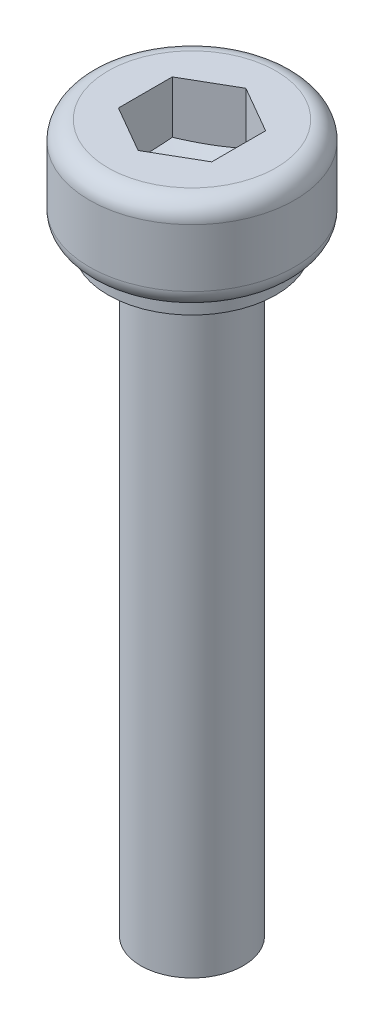
ISO-10303-21;
HEADER;
FILE_DESCRIPTION(('STEP AP214'),'2;1');
FILE_NAME('part.step','',(''),(''),'','','');
FILE_SCHEMA(('AUTOMOTIVE_DESIGN { 1 0 10303 214 1 1 1 1 }'));
ENDSEC;
DATA;
#1=APPLICATION_CONTEXT('core data for automotive mechanical design processes');
#2=APPLICATION_PROTOCOL_DEFINITION('international standard','automotive_design',2000,#1);
#3=PRODUCT_CONTEXT('',#1,'mechanical');
#4=PRODUCT('Part','Part','',(#3));
#5=PRODUCT_RELATED_PRODUCT_CATEGORY('part','',(#4));
#6=PRODUCT_DEFINITION_FORMATION('','',#4);
#7=PRODUCT_DEFINITION_CONTEXT('part definition',#1,'design');
#8=PRODUCT_DEFINITION('design','',#6,#7);
#9=PRODUCT_DEFINITION_SHAPE('','',#8);
#10=(LENGTH_UNIT() NAMED_UNIT(*) SI_UNIT(.MILLI.,.METRE.));
#11=(NAMED_UNIT(*) PLANE_ANGLE_UNIT() SI_UNIT($,.RADIAN.));
#12=(NAMED_UNIT(*) SI_UNIT($,.STERADIAN.) SOLID_ANGLE_UNIT());
#13=UNCERTAINTY_MEASURE_WITH_UNIT(LENGTH_MEASURE(1.E-05),#10,'distance_accuracy_value','');
#14=(GEOMETRIC_REPRESENTATION_CONTEXT(3) GLOBAL_UNCERTAINTY_ASSIGNED_CONTEXT((#13)) GLOBAL_UNIT_ASSIGNED_CONTEXT((#10,
#11,#12)) REPRESENTATION_CONTEXT('',''));
#15=CARTESIAN_POINT('',(0.,0.,0.));
#16=DIRECTION('',(0.,0.,1.));
#17=DIRECTION('',(1.,0.,0.));
#18=AXIS2_PLACEMENT_3D('',#15,#16,#17);
#19=CARTESIAN_POINT('',(0.,9.475,0.));
#20=DIRECTION('',(0.,-1.,0.));
#21=DIRECTION('',(0.,0.,-1.));
#22=AXIS2_PLACEMENT_3D('',#19,#20,#21);
#23=PLANE('',#22);
#24=DIRECTION('',(-0.866025403784439,0.,0.5));
#25=VECTOR('',#24,1.);
#26=CARTESIAN_POINT('',(0.,9.475,-1.44337567297406));
#27=LINE('',#26,#25);
#28=CARTESIAN_POINT('',(0.,9.475,-1.44337567297406));
#29=VERTEX_POINT('',#28);
#30=CARTESIAN_POINT('',(-1.25,9.475,-0.721687836487033));
#31=VERTEX_POINT('',#30);
#32=EDGE_CURVE('E215',#29,#31,#27,.T.);
#33=ORIENTED_EDGE('',*,*,#32,.F.);
#34=DIRECTION('',(-0.866025403784439,0.,-0.5));
#35=VECTOR('',#34,1.);
#36=CARTESIAN_POINT('',(1.25,9.475,-0.721687836487033));
#37=LINE('',#36,#35);
#38=CARTESIAN_POINT('',(1.25,9.475,-0.721687836487033));
#39=VERTEX_POINT('',#38);
#40=EDGE_CURVE('E64',#39,#29,#37,.T.);
#41=ORIENTED_EDGE('',*,*,#40,.F.);
#42=DIRECTION('',(0.,0.,-1.));
#43=VECTOR('',#42,1.);
#44=CARTESIAN_POINT('',(1.25,9.475,0.721687836487033));
#45=LINE('',#44,#43);
#46=CARTESIAN_POINT('',(1.25,9.475,0.721687836487033));
#47=VERTEX_POINT('',#46);
#48=EDGE_CURVE('E126',#47,#39,#45,.T.);
#49=ORIENTED_EDGE('',*,*,#48,.F.);
#50=DIRECTION('',(0.866025403784439,0.,-0.5));
#51=VECTOR('',#50,1.);
#52=CARTESIAN_POINT('',(0.,9.475,1.44337567297406));
#53=LINE('',#52,#51);
#54=CARTESIAN_POINT('',(0.,9.475,1.44337567297406));
#55=VERTEX_POINT('',#54);
#56=EDGE_CURVE('E133',#55,#47,#53,.T.);
#57=ORIENTED_EDGE('',*,*,#56,.F.);
#58=DIRECTION('',(0.866025403784439,0.,0.5));
#59=VECTOR('',#58,1.);
#60=CARTESIAN_POINT('',(-1.25,9.475,0.721687836487033));
#61=LINE('',#60,#59);
#62=CARTESIAN_POINT('',(-1.25,9.475,0.721687836487033));
#63=VERTEX_POINT('',#62);
#64=EDGE_CURVE('E392',#63,#55,#61,.T.);
#65=ORIENTED_EDGE('',*,*,#64,.F.);
#66=DIRECTION('',(0.,0.,1.));
#67=VECTOR('',#66,1.);
#68=CARTESIAN_POINT('',(-1.25,9.475,-0.721687836487033));
#69=LINE('',#68,#67);
#70=EDGE_CURVE('E406',#31,#63,#69,.T.);
#71=ORIENTED_EDGE('',*,*,#70,.F.);
#72=EDGE_LOOP('',(#33,#41,#49,#57,#65,#71));
#73=FACE_BOUND('',#72,.T.);
#74=CARTESIAN_POINT('',(0.,9.475,0.));
#75=DIRECTION('',(0.,1.,0.));
#76=DIRECTION('',(0.,0.,1.));
#77=AXIS2_PLACEMENT_3D('',#74,#75,#76);
#78=CIRCLE('',#77,2.25);
#79=CARTESIAN_POINT('',(0.,9.475,2.25));
#80=VERTEX_POINT('',#79);
#81=EDGE_CURVE('E11',#80,#80,#78,.T.);
#82=ORIENTED_EDGE('',*,*,#81,.T.);
#83=EDGE_LOOP('',(#82));
#84=FACE_BOUND('',#83,.T.);
#85=ADVANCED_FACE('F49',(#73,#84),#23,.F.);
#86=CARTESIAN_POINT('',(0.,8.975,0.));
#87=DIRECTION('',(0.,1.,0.));
#88=DIRECTION('',(0.,0.,1.));
#89=AXIS2_PLACEMENT_3D('',#86,#87,#88);
#90=TOROIDAL_SURFACE('',#89,2.25,0.5);
#91=ORIENTED_EDGE('',*,*,#81,.F.);
#92=EDGE_LOOP('',(#91));
#93=FACE_BOUND('',#92,.T.);
#94=CARTESIAN_POINT('',(0.,8.975,0.));
#95=DIRECTION('',(0.,1.,0.));
#96=DIRECTION('',(0.,0.,1.));
#97=AXIS2_PLACEMENT_3D('',#94,#95,#96);
#98=CIRCLE('',#97,2.75);
#99=CARTESIAN_POINT('',(0.,8.975,2.75));
#100=VERTEX_POINT('',#99);
#101=EDGE_CURVE('E57',#100,#100,#98,.T.);
#102=ORIENTED_EDGE('',*,*,#101,.T.);
#103=EDGE_LOOP('',(#102));
#104=FACE_BOUND('',#103,.T.);
#105=ADVANCED_FACE('F206',(#93,#104),#90,.T.);
#106=CARTESIAN_POINT('',(0.,4.09422492401216,0.));
#107=DIRECTION('',(0.,1.,0.));
#108=DIRECTION('',(0.,0.,1.));
#109=AXIS2_PLACEMENT_3D('',#106,#107,#108);
#110=CYLINDRICAL_SURFACE('',#109,2.75);
#111=ORIENTED_EDGE('',*,*,#101,.F.);
#112=EDGE_LOOP('',(#111));
#113=FACE_BOUND('',#112,.T.);
#114=CARTESIAN_POINT('',(0.,7.425,0.));
#115=DIRECTION('',(0.,1.,0.));
#116=DIRECTION('',(0.,0.,1.));
#117=AXIS2_PLACEMENT_3D('',#114,#115,#116);
#118=CIRCLE('',#117,2.75);
#119=CARTESIAN_POINT('',(0.,7.425,2.75));
#120=VERTEX_POINT('',#119);
#121=EDGE_CURVE('E222',#120,#120,#118,.T.);
#122=ORIENTED_EDGE('',*,*,#121,.T.);
#123=EDGE_LOOP('',(#122));
#124=FACE_BOUND('',#123,.T.);
#125=ADVANCED_FACE('F211',(#113,#124),#110,.T.);
#126=CARTESIAN_POINT('',(0.,7.425,0.));
#127=DIRECTION('',(0.,1.,0.));
#128=DIRECTION('',(0.,0.,1.));
#129=AXIS2_PLACEMENT_3D('',#126,#127,#128);
#130=TOROIDAL_SURFACE('',#129,2.25,0.5);
#131=ORIENTED_EDGE('',*,*,#121,.F.);
#132=EDGE_LOOP('',(#131));
#133=FACE_BOUND('',#132,.T.);
#134=CARTESIAN_POINT('',(0.,6.925,0.));
#135=DIRECTION('',(0.,1.,0.));
#136=DIRECTION('',(0.,0.,1.));
#137=AXIS2_PLACEMENT_3D('',#134,#135,#136);
#138=CIRCLE('',#137,2.25);
#139=CARTESIAN_POINT('',(0.,6.925,2.25));
#140=VERTEX_POINT('',#139);
#141=EDGE_CURVE('E225',#140,#140,#138,.T.);
#142=ORIENTED_EDGE('',*,*,#141,.T.);
#143=EDGE_LOOP('',(#142));
#144=FACE_BOUND('',#143,.T.);
#145=ADVANCED_FACE('F262',(#133,#144),#130,.T.);
#146=CARTESIAN_POINT('',(0.,4.09422492401216,0.));
#147=DIRECTION('',(0.,1.,0.));
#148=DIRECTION('',(0.,0.,1.));
#149=AXIS2_PLACEMENT_3D('',#146,#147,#148);
#150=CYLINDRICAL_SURFACE('',#149,2.25);
#151=ORIENTED_EDGE('',*,*,#141,.F.);
#152=EDGE_LOOP('',(#151));
#153=FACE_BOUND('',#152,.T.);
#154=CARTESIAN_POINT('',(0.,6.525,0.));
#155=DIRECTION('',(0.,1.,0.));
#156=DIRECTION('',(0.,0.,1.));
#157=AXIS2_PLACEMENT_3D('',#154,#155,#156);
#158=CIRCLE('',#157,2.25);
#159=CARTESIAN_POINT('',(0.,6.525,2.25));
#160=VERTEX_POINT('',#159);
#161=EDGE_CURVE('E231',#160,#160,#158,.T.);
#162=ORIENTED_EDGE('',*,*,#161,.T.);
#163=EDGE_LOOP('',(#162));
#164=FACE_BOUND('',#163,.T.);
#165=ADVANCED_FACE('F258',(#153,#164),#150,.T.);
#166=CARTESIAN_POINT('',(2.25,6.525,0.));
#167=DIRECTION('',(0.,1.,0.));
#168=DIRECTION('',(0.,0.,1.));
#169=AXIS2_PLACEMENT_3D('',#166,#167,#168);
#170=PLANE('',#169);
#171=ORIENTED_EDGE('',*,*,#161,.F.);
#172=EDGE_LOOP('',(#171));
#173=FACE_BOUND('',#172,.T.);
#174=CARTESIAN_POINT('',(0.,6.525,0.));
#175=DIRECTION('',(0.,1.,0.));
#176=DIRECTION('',(0.,0.,1.));
#177=AXIS2_PLACEMENT_3D('',#174,#175,#176);
#178=CIRCLE('',#177,1.375);
#179=CARTESIAN_POINT('',(0.,6.525,1.375));
#180=VERTEX_POINT('',#179);
#181=EDGE_CURVE('E234',#180,#180,#178,.T.);
#182=ORIENTED_EDGE('',*,*,#181,.T.);
#183=EDGE_LOOP('',(#182));
#184=FACE_BOUND('',#183,.T.);
#185=ADVANCED_FACE('F251',(#173,#184),#170,.F.);
#186=CARTESIAN_POINT('',(0.,4.09422492401216,0.));
#187=DIRECTION('',(0.,1.,0.));
#188=DIRECTION('',(0.,0.,1.));
#189=AXIS2_PLACEMENT_3D('',#186,#187,#188);
#190=CYLINDRICAL_SURFACE('',#189,1.375);
#191=ORIENTED_EDGE('',*,*,#181,.F.);
#192=EDGE_LOOP('',(#191));
#193=FACE_BOUND('',#192,.T.);
#194=CARTESIAN_POINT('',(0.,-9.475,0.));
#195=DIRECTION('',(0.,1.,0.));
#196=DIRECTION('',(0.,0.,1.));
#197=AXIS2_PLACEMENT_3D('',#194,#195,#196);
#198=CIRCLE('',#197,1.375);
#199=CARTESIAN_POINT('',(0.,-9.475,1.375));
#200=VERTEX_POINT('',#199);
#201=EDGE_CURVE('E112',#200,#200,#198,.T.);
#202=ORIENTED_EDGE('',*,*,#201,.T.);
#203=EDGE_LOOP('',(#202));
#204=FACE_BOUND('',#203,.T.);
#205=ADVANCED_FACE('F243',(#193,#204),#190,.T.);
#206=CARTESIAN_POINT('',(1.375,-9.475,0.));
#207=DIRECTION('',(0.,1.,0.));
#208=DIRECTION('',(0.,0.,1.));
#209=AXIS2_PLACEMENT_3D('',#206,#207,#208);
#210=PLANE('',#209);
#211=ORIENTED_EDGE('',*,*,#201,.F.);
#212=EDGE_LOOP('',(#211));
#213=FACE_BOUND('',#212,.T.);
#214=ADVANCED_FACE('F245',(#213),#210,.F.);
#215=CARTESIAN_POINT('',(1.25,7.475,-0.721687836487033));
#216=DIRECTION('',(0.5,0.,-0.866025403784439));
#217=DIRECTION('',(-0.866025403784439,0.,-0.5));
#218=AXIS2_PLACEMENT_3D('',#215,#216,#217);
#219=PLANE('',#218);
#220=CARTESIAN_POINT('',(-0.000199999999999668,8.07502213659224,-1.4434911430279));
#221=CARTESIAN_POINT('',(0.0518104295641314,8.06926246143579,-1.41346290751838));
#222=CARTESIAN_POINT('',(0.103869536937207,8.06403974723522,-1.38340656786277));
#223=CARTESIAN_POINT('',(0.208081999228773,8.05487120303171,-1.32323947470582));
#224=CARTESIAN_POINT('',(0.260235371100697,8.05092563186543,-1.29312871141642));
#225=CARTESIAN_POINT('',(0.364473709342653,8.0445253362828,-1.23294667877254));
#226=CARTESIAN_POINT('',(0.416558490077755,8.04206668415272,-1.20287551659445));
#227=CARTESIAN_POINT('',(0.520762183051685,8.03877043652459,-1.1427134864054));
#228=CARTESIAN_POINT('',(0.572881091525842,8.03793268513289,-1.11262262056797));
#229=CARTESIAN_POINT('',(0.677118908474158,8.03793268513289,-1.05244088889312));
#230=CARTESIAN_POINT('',(0.729237816948315,8.03877043652459,-1.0223500230557));
#231=CARTESIAN_POINT('',(0.833441509922245,8.04206668415272,-0.962187992866649));
#232=CARTESIAN_POINT('',(0.885526290657347,8.0445253362828,-0.932116830688555));
#233=CARTESIAN_POINT('',(0.989764628899302,8.05092563186543,-0.871934798044683));
#234=CARTESIAN_POINT('',(1.04191800077123,8.05487120303171,-0.84182403475528));
#235=CARTESIAN_POINT('',(1.14613046306279,8.06403974723522,-0.781656941598331));
#236=CARTESIAN_POINT('',(1.19818957043587,8.06926246143579,-0.751600601942714));
#237=CARTESIAN_POINT('',(1.2502,8.07502213659224,-0.721572366433195));
#238=B_SPLINE_CURVE_WITH_KNOTS('',3,(#220,#221,#222,#223,#224,#225,#226,#227,#228,#229,#230,
#231,#232,#233,#234,#235,#236,#237),.UNSPECIFIED.,.F.,.F.,(4,2,2,2,2,2,2,2,4),(0.,
0.181000745388271,0.362038150988404,0.542595231362164,0.723134945402974,0.903674659443784,
1.08423173981754,1.26526914541768,1.44626989080595),.UNSPECIFIED.);
#239=CARTESIAN_POINT('',(0.,8.075,-1.44337567297406));
#240=VERTEX_POINT('',#239);
#241=CARTESIAN_POINT('',(1.25,8.075,-0.721687836487033));
#242=VERTEX_POINT('',#241);
#243=EDGE_CURVE('E116',#240,#242,#238,.T.);
#244=ORIENTED_EDGE('',*,*,#243,.T.);
#245=DIRECTION('',(0.,1.,0.));
#246=VECTOR('',#245,1.);
#247=CARTESIAN_POINT('',(1.25,7.475,-0.721687836487033));
#248=LINE('',#247,#246);
#249=EDGE_CURVE('E113',#242,#39,#248,.T.);
#250=ORIENTED_EDGE('',*,*,#249,.T.);
#251=ORIENTED_EDGE('',*,*,#40,.T.);
#252=DIRECTION('',(0.,1.,0.));
#253=VECTOR('',#252,1.);
#254=CARTESIAN_POINT('',(0.,7.475,-1.44337567297406));
#255=LINE('',#254,#253);
#256=EDGE_CURVE('E107',#240,#29,#255,.T.);
#257=ORIENTED_EDGE('',*,*,#256,.F.);
#258=EDGE_LOOP('',(#244,#250,#251,#257));
#259=FACE_BOUND('',#258,.T.);
#260=ADVANCED_FACE('F124',(#259),#219,.F.);
#261=CARTESIAN_POINT('',(1.25,7.475,0.721687836487033));
#262=DIRECTION('',(1.,0.,0.));
#263=DIRECTION('',(0.,0.,-1.));
#264=AXIS2_PLACEMENT_3D('',#261,#262,#263);
#265=PLANE('',#264);
#266=CARTESIAN_POINT('',(1.25,8.27986393266067,-2.17905403611333));
#267=CARTESIAN_POINT('',(1.25,8.26241167422932,-2.07395009860659));
#268=CARTESIAN_POINT('',(1.25,8.24522032681985,-1.96879996781174));
#269=CARTESIAN_POINT('',(1.25,8.21170531820386,-1.75835059041696));
#270=CARTESIAN_POINT('',(1.25,8.1953817490476,-1.65305132920933));
#271=CARTESIAN_POINT('',(1.25,8.16387651632622,-1.44176294489903));
#272=CARTESIAN_POINT('',(1.25,8.14870071461258,-1.33577293769499));
#273=CARTESIAN_POINT('',(1.25,8.12016928542285,-1.12353979169022));
#274=CARTESIAN_POINT('',(1.25,8.10681373080936,-1.01729664292962));
#275=CARTESIAN_POINT('',(1.25,8.08296213919632,-0.806005172192659));
#276=CARTESIAN_POINT('',(1.25,8.0724282853726,-0.700961236680106));
#277=CARTESIAN_POINT('',(1.25,8.05508287381984,-0.49056779087624));
#278=CARTESIAN_POINT('',(1.25,8.04827077429862,-0.385218327307924));
#279=CARTESIAN_POINT('',(1.25,8.03946010519578,-0.174546490096706));
#280=CARTESIAN_POINT('',(1.25,8.03745059762555,-0.0692246022002213));
#281=CARTESIAN_POINT('',(1.25,8.03861439807437,0.141392413524251));
#282=CARTESIAN_POINT('',(1.25,8.04178784167731,0.246687540580118));
#283=CARTESIAN_POINT('',(1.25,8.0511996283626,0.428094047279166));
#284=CARTESIAN_POINT('',(1.25,8.05635479919092,0.504266022941004));
#285=CARTESIAN_POINT('',(1.25,8.06864181101614,0.656446776567252));
#286=CARTESIAN_POINT('',(1.25,8.0757736272437,0.732455556564639));
#287=CARTESIAN_POINT('',(1.25,8.09949527042362,0.960485133272157));
#288=CARTESIAN_POINT('',(1.25,8.11839567377015,1.11226253619117));
#289=CARTESIAN_POINT('',(1.25,8.14949527165966,1.34036100724888));
#290=CARTESIAN_POINT('',(1.25,8.16038509955885,1.41687238761891));
#291=CARTESIAN_POINT('',(1.25,8.18286077200284,1.56979468542723));
#292=CARTESIAN_POINT('',(1.25,8.19444662073168,1.64620560225877));
#293=CARTESIAN_POINT('',(1.25,8.21810928108022,1.7987279380359));
#294=CARTESIAN_POINT('',(1.25,8.2301846025663,1.87483959068598));
#295=CARTESIAN_POINT('',(1.25,8.25474485969705,2.02699389967147));
#296=CARTESIAN_POINT('',(1.25,8.26722977968569,2.10303655853011));
#297=CARTESIAN_POINT('',(1.25,8.27986393266067,2.17905403611333));
#298=B_SPLINE_CURVE_WITH_KNOTS('',3,(#266,#267,#268,#269,#270,#271,#272,#273,#274,#275,#276,
#277,#278,#279,#280,#281,#282,#283,#284,#285,#286,#287,#288,#289,#290,#291,#292,#293,#294,#295,
#296,#297),.UNSPECIFIED.,.F.,.F.,(4,2,2,2,2,2,2,2,2,2,2,2,2,2,2,4),(0.,0.319633094293302,
0.639300026536297,0.960502494708347,1.28171781650624,1.59838422210634,1.91500451689018,
2.23090301324148,2.54680977350041,2.77582029179634,3.00482794049193,3.46358394927293,
3.69543178901939,3.92728102262634,4.15847082499727,4.38965180089788),.UNSPECIFIED.);
#299=CARTESIAN_POINT('',(1.25,8.075,0.721687836487033));
#300=VERTEX_POINT('',#299);
#301=EDGE_CURVE('E120',#242,#300,#298,.T.);
#302=ORIENTED_EDGE('',*,*,#301,.T.);
#303=DIRECTION('',(0.,1.,0.));
#304=VECTOR('',#303,1.);
#305=CARTESIAN_POINT('',(1.25,7.475,0.721687836487033));
#306=LINE('',#305,#304);
#307=EDGE_CURVE('E390',#300,#47,#306,.T.);
#308=ORIENTED_EDGE('',*,*,#307,.T.);
#309=ORIENTED_EDGE('',*,*,#48,.T.);
#310=ORIENTED_EDGE('',*,*,#249,.F.);
#311=EDGE_LOOP('',(#302,#308,#309,#310));
#312=FACE_BOUND('',#311,.T.);
#313=ADVANCED_FACE('F188',(#312),#265,.F.);
#314=CARTESIAN_POINT('',(0.,7.475,1.44337567297406));
#315=DIRECTION('',(0.5,0.,0.866025403784439));
#316=DIRECTION('',(0.866025403784439,0.,-0.5));
#317=AXIS2_PLACEMENT_3D('',#314,#315,#316);
#318=PLANE('',#317);
#319=CARTESIAN_POINT('',(1.2502,8.07502213659224,0.721572366433195));
#320=CARTESIAN_POINT('',(1.19818957043587,8.06926246143579,0.751600601942714));
#321=CARTESIAN_POINT('',(1.14613046306279,8.06403974723522,0.781656941598331));
#322=CARTESIAN_POINT('',(1.04191800077123,8.05487120303171,0.84182403475528));
#323=CARTESIAN_POINT('',(0.989764628899302,8.05092563186543,0.871934798044683));
#324=CARTESIAN_POINT('',(0.885526290657347,8.0445253362828,0.932116830688555));
#325=CARTESIAN_POINT('',(0.833441509922245,8.04206668415272,0.962187992866649));
#326=CARTESIAN_POINT('',(0.729237816948315,8.03877043652459,1.0223500230557));
#327=CARTESIAN_POINT('',(0.677118908474157,8.03793268513289,1.05244088889312));
#328=CARTESIAN_POINT('',(0.572881091525842,8.03793268513289,1.11262262056797));
#329=CARTESIAN_POINT('',(0.520762183051684,8.03877043652459,1.1427134864054));
#330=CARTESIAN_POINT('',(0.416558490077755,8.04206668415272,1.20287551659445));
#331=CARTESIAN_POINT('',(0.364473709342652,8.0445253362828,1.23294667877254));
#332=CARTESIAN_POINT('',(0.260235371100697,8.05092563186543,1.29312871141642));
#333=CARTESIAN_POINT('',(0.208081999228772,8.05487120303171,1.32323947470582));
#334=CARTESIAN_POINT('',(0.103869536937206,8.06403974723522,1.38340656786277));
#335=CARTESIAN_POINT('',(0.0518104295641308,8.06926246143579,1.41346290751838));
#336=CARTESIAN_POINT('',(-0.000200000000000338,8.07502213659224,1.4434911430279));
#337=B_SPLINE_CURVE_WITH_KNOTS('',3,(#319,#320,#321,#322,#323,#324,#325,#326,#327,#328,#329,
#330,#331,#332,#333,#334,#335,#336),.UNSPECIFIED.,.F.,.F.,(4,2,2,2,2,2,2,2,4),(0.,
0.181000745388271,0.362038150988404,0.542595231362164,0.723134945402974,0.903674659443785,
1.08423173981754,1.26526914541768,1.44626989080595),.UNSPECIFIED.);
#338=CARTESIAN_POINT('',(0.,8.075,1.44337567297406));
#339=VERTEX_POINT('',#338);
#340=EDGE_CURVE('E171',#300,#339,#337,.T.);
#341=ORIENTED_EDGE('',*,*,#340,.T.);
#342=DIRECTION('',(0.,1.,0.));
#343=VECTOR('',#342,1.);
#344=CARTESIAN_POINT('',(0.,7.475,1.44337567297406));
#345=LINE('',#344,#343);
#346=EDGE_CURVE('E388',#339,#55,#345,.T.);
#347=ORIENTED_EDGE('',*,*,#346,.T.);
#348=ORIENTED_EDGE('',*,*,#56,.T.);
#349=ORIENTED_EDGE('',*,*,#307,.F.);
#350=EDGE_LOOP('',(#341,#347,#348,#349));
#351=FACE_BOUND('',#350,.T.);
#352=ADVANCED_FACE('F191',(#351),#318,.F.);
#353=CARTESIAN_POINT('',(-1.25,7.475,0.721687836487033));
#354=DIRECTION('',(-0.5,0.,0.866025403784439));
#355=DIRECTION('',(0.866025403784439,0.,0.5));
#356=AXIS2_PLACEMENT_3D('',#353,#354,#355);
#357=PLANE('',#356);
#358=CARTESIAN_POINT('',(0.000199999999999786,8.07502213659224,1.4434911430279));
#359=CARTESIAN_POINT('',(-0.0518104295641314,8.06926246143579,1.41346290751838));
#360=CARTESIAN_POINT('',(-0.103869536937207,8.06403974723522,1.38340656786277));
#361=CARTESIAN_POINT('',(-0.208081999228772,8.05487120303171,1.32323947470582));
#362=CARTESIAN_POINT('',(-0.260235371100697,8.05092563186543,1.29312871141641));
#363=CARTESIAN_POINT('',(-0.364473709342653,8.0445253362828,1.23294667877254));
#364=CARTESIAN_POINT('',(-0.416558490077755,8.04206668415272,1.20287551659445));
#365=CARTESIAN_POINT('',(-0.520762183051685,8.03877043652459,1.1427134864054));
#366=CARTESIAN_POINT('',(-0.572881091525842,8.03793268513289,1.11262262056797));
#367=CARTESIAN_POINT('',(-0.677118908474158,8.03793268513289,1.05244088889312));
#368=CARTESIAN_POINT('',(-0.729237816948316,8.03877043652459,1.0223500230557));
#369=CARTESIAN_POINT('',(-0.833441509922245,8.04206668415272,0.962187992866648));
#370=CARTESIAN_POINT('',(-0.885526290657347,8.0445253362828,0.932116830688554));
#371=CARTESIAN_POINT('',(-0.989764628899303,8.05092563186543,0.871934798044682));
#372=CARTESIAN_POINT('',(-1.04191800077123,8.05487120303171,0.84182403475528));
#373=CARTESIAN_POINT('',(-1.14613046306279,8.06403974723522,0.781656941598331));
#374=CARTESIAN_POINT('',(-1.19818957043587,8.06926246143579,0.751600601942714));
#375=CARTESIAN_POINT('',(-1.2502,8.07502213659224,0.721572366433195));
#376=B_SPLINE_CURVE_WITH_KNOTS('',3,(#358,#359,#360,#361,#362,#363,#364,#365,#366,#367,#368,
#369,#370,#371,#372,#373,#374,#375),.UNSPECIFIED.,.F.,.F.,(4,2,2,2,2,2,2,2,4),(0.,
0.181000745388271,0.362038150988405,0.542595231362164,0.723134945402975,0.903674659443785,
1.08423173981754,1.26526914541768,1.44626989080595),.UNSPECIFIED.);
#377=CARTESIAN_POINT('',(-1.25,8.075,0.721687836487033));
#378=VERTEX_POINT('',#377);
#379=EDGE_CURVE('E164',#339,#378,#376,.T.);
#380=ORIENTED_EDGE('',*,*,#379,.T.);
#381=DIRECTION('',(0.,1.,0.));
#382=VECTOR('',#381,1.);
#383=CARTESIAN_POINT('',(-1.25,7.475,0.721687836487033));
#384=LINE('',#383,#382);
#385=EDGE_CURVE('E130',#378,#63,#384,.T.);
#386=ORIENTED_EDGE('',*,*,#385,.T.);
#387=ORIENTED_EDGE('',*,*,#64,.T.);
#388=ORIENTED_EDGE('',*,*,#346,.F.);
#389=EDGE_LOOP('',(#380,#386,#387,#388));
#390=FACE_BOUND('',#389,.T.);
#391=ADVANCED_FACE('F195',(#390),#357,.F.);
#392=CARTESIAN_POINT('',(-1.25,7.475,-0.721687836487033));
#393=DIRECTION('',(-1.,0.,0.));
#394=DIRECTION('',(0.,0.,1.));
#395=AXIS2_PLACEMENT_3D('',#392,#393,#394);
#396=PLANE('',#395);
#397=CARTESIAN_POINT('',(-1.25,8.27986393266067,2.17905403611333));
#398=CARTESIAN_POINT('',(-1.25,8.26241167422932,2.07395009860659));
#399=CARTESIAN_POINT('',(-1.25,8.24522032681985,1.96879996781174));
#400=CARTESIAN_POINT('',(-1.25,8.21170531820386,1.75835059041696));
#401=CARTESIAN_POINT('',(-1.25,8.1953817490476,1.65305132920933));
#402=CARTESIAN_POINT('',(-1.25,8.16387651632622,1.44176294489903));
#403=CARTESIAN_POINT('',(-1.25,8.14870071461258,1.33577293769499));
#404=CARTESIAN_POINT('',(-1.25,8.12016928542285,1.12353979169022));
#405=CARTESIAN_POINT('',(-1.25,8.10681373080936,1.01729664292962));
#406=CARTESIAN_POINT('',(-1.25,8.08296213919632,0.806005172192658));
#407=CARTESIAN_POINT('',(-1.25,8.0724282853726,0.700961236680106));
#408=CARTESIAN_POINT('',(-1.25,8.05508287381984,0.49056779087624));
#409=CARTESIAN_POINT('',(-1.25,8.04827077429862,0.385218327307924));
#410=CARTESIAN_POINT('',(-1.25,8.03946010519578,0.174546490096706));
#411=CARTESIAN_POINT('',(-1.25,8.03745059762555,0.069224602200221));
#412=CARTESIAN_POINT('',(-1.25,8.03861439807437,-0.141392413524251));
#413=CARTESIAN_POINT('',(-1.25,8.04178784167731,-0.246687540580118));
#414=CARTESIAN_POINT('',(-1.25,8.0511996283626,-0.428094047279167));
#415=CARTESIAN_POINT('',(-1.25,8.05635479919092,-0.504266022941004));
#416=CARTESIAN_POINT('',(-1.25,8.06864181101614,-0.656446776567251));
#417=CARTESIAN_POINT('',(-1.25,8.0757736272437,-0.732455556564639));
#418=CARTESIAN_POINT('',(-1.25,8.09949527042362,-0.960485133272157));
#419=CARTESIAN_POINT('',(-1.25,8.11839567377015,-1.11226253619117));
#420=CARTESIAN_POINT('',(-1.25,8.14949527165966,-1.34036100724888));
#421=CARTESIAN_POINT('',(-1.25,8.16038509955885,-1.41687238761891));
#422=CARTESIAN_POINT('',(-1.25,8.18286077200284,-1.56979468542723));
#423=CARTESIAN_POINT('',(-1.25,8.19444662073168,-1.64620560225877));
#424=CARTESIAN_POINT('',(-1.25,8.21810928108022,-1.7987279380359));
#425=CARTESIAN_POINT('',(-1.25,8.2301846025663,-1.87483959068598));
#426=CARTESIAN_POINT('',(-1.25,8.25474485969705,-2.02699389967147));
#427=CARTESIAN_POINT('',(-1.25,8.26722977968569,-2.10303655853011));
#428=CARTESIAN_POINT('',(-1.25,8.27986393266067,-2.17905403611333));
#429=B_SPLINE_CURVE_WITH_KNOTS('',3,(#397,#398,#399,#400,#401,#402,#403,#404,#405,#406,#407,
#408,#409,#410,#411,#412,#413,#414,#415,#416,#417,#418,#419,#420,#421,#422,#423,#424,#425,#426,
#427,#428),.UNSPECIFIED.,.F.,.F.,(4,2,2,2,2,2,2,2,2,2,2,2,2,2,2,4),(0.,0.319633094293302,
0.639300026536297,0.960502494708347,1.28171781650624,1.59838422210634,1.91500451689018,
2.23090301324148,2.54680977350041,2.77582029179634,3.00482794049193,3.46358394927293,
3.69543178901939,3.92728102262634,4.15847082499727,4.38965180089788),.UNSPECIFIED.);
#430=CARTESIAN_POINT('',(-1.25,8.075,-0.721687836487033));
#431=VERTEX_POINT('',#430);
#432=EDGE_CURVE('E72',#378,#431,#429,.T.);
#433=ORIENTED_EDGE('',*,*,#432,.T.);
#434=DIRECTION('',(0.,1.,0.));
#435=VECTOR('',#434,1.);
#436=CARTESIAN_POINT('',(-1.25,7.475,-0.721687836487033));
#437=LINE('',#436,#435);
#438=EDGE_CURVE('E109',#431,#31,#437,.T.);
#439=ORIENTED_EDGE('',*,*,#438,.T.);
#440=ORIENTED_EDGE('',*,*,#70,.T.);
#441=ORIENTED_EDGE('',*,*,#385,.F.);
#442=EDGE_LOOP('',(#433,#439,#440,#441));
#443=FACE_BOUND('',#442,.T.);
#444=ADVANCED_FACE('F199',(#443),#396,.F.);
#445=CARTESIAN_POINT('',(0.,7.475,-1.44337567297406));
#446=DIRECTION('',(-0.5,0.,-0.866025403784439));
#447=DIRECTION('',(-0.866025403784439,0.,0.5));
#448=AXIS2_PLACEMENT_3D('',#445,#446,#447);
#449=PLANE('',#448);
#450=CARTESIAN_POINT('',(-1.2502,8.07502213659224,-0.721572366433195));
#451=CARTESIAN_POINT('',(-1.19818957043587,8.06926246143579,-0.751600601942714));
#452=CARTESIAN_POINT('',(-1.14613046306279,8.06403974723522,-0.781656941598331));
#453=CARTESIAN_POINT('',(-1.04191800077123,8.05487120303171,-0.84182403475528));
#454=CARTESIAN_POINT('',(-0.989764628899302,8.05092563186543,-0.871934798044683));
#455=CARTESIAN_POINT('',(-0.885526290657347,8.0445253362828,-0.932116830688555));
#456=CARTESIAN_POINT('',(-0.833441509922245,8.04206668415272,-0.962187992866649));
#457=CARTESIAN_POINT('',(-0.729237816948315,8.03877043652459,-1.0223500230557));
#458=CARTESIAN_POINT('',(-0.677118908474157,8.03793268513289,-1.05244088889312));
#459=CARTESIAN_POINT('',(-0.572881091525842,8.03793268513289,-1.11262262056797));
#460=CARTESIAN_POINT('',(-0.520762183051684,8.03877043652459,-1.1427134864054));
#461=CARTESIAN_POINT('',(-0.416558490077755,8.04206668415272,-1.20287551659445));
#462=CARTESIAN_POINT('',(-0.364473709342653,8.0445253362828,-1.23294667877254));
#463=CARTESIAN_POINT('',(-0.260235371100697,8.05092563186543,-1.29312871141641));
#464=CARTESIAN_POINT('',(-0.208081999228772,8.05487120303171,-1.32323947470582));
#465=CARTESIAN_POINT('',(-0.103869536937207,8.06403974723522,-1.38340656786277));
#466=CARTESIAN_POINT('',(-0.0518104295641308,8.06926246143579,-1.41346290751838));
#467=CARTESIAN_POINT('',(0.00020000000000028,8.07502213659224,-1.4434911430279));
#468=B_SPLINE_CURVE_WITH_KNOTS('',3,(#450,#451,#452,#453,#454,#455,#456,#457,#458,#459,#460,
#461,#462,#463,#464,#465,#466,#467),.UNSPECIFIED.,.F.,.F.,(4,2,2,2,2,2,2,2,4),(0.,
0.181000745388271,0.362038150988405,0.542595231362164,0.723134945402975,0.903674659443785,
1.08423173981754,1.26526914541768,1.44626989080595),.UNSPECIFIED.);
#469=EDGE_CURVE('E103',#431,#240,#468,.T.);
#470=ORIENTED_EDGE('',*,*,#469,.T.);
#471=ORIENTED_EDGE('',*,*,#256,.T.);
#472=ORIENTED_EDGE('',*,*,#32,.T.);
#473=ORIENTED_EDGE('',*,*,#438,.F.);
#474=EDGE_LOOP('',(#470,#471,#472,#473));
#475=FACE_BOUND('',#474,.T.);
#476=ADVANCED_FACE('F105',(#475),#449,.F.);
#477=CARTESIAN_POINT('',(0.,7.875,0.));
#478=DIRECTION('',(0.,1.,0.));
#479=DIRECTION('',(0.,0.,1.));
#480=AXIS2_PLACEMENT_3D('',#477,#478,#479);
#481=PLANE('',#480);
#482=CARTESIAN_POINT('',(0.,7.875,0.));
#483=DIRECTION('',(0.,-1.,0.));
#484=DIRECTION('',(0.,0.,-1.));
#485=AXIS2_PLACEMENT_3D('',#482,#483,#484);
#486=CIRCLE('',#485,0.4);
#487=CARTESIAN_POINT('',(0.,7.875,-0.4));
#488=VERTEX_POINT('',#487);
#489=EDGE_CURVE('E379',#488,#488,#486,.T.);
#490=ORIENTED_EDGE('',*,*,#489,.F.);
#491=EDGE_LOOP('',(#490));
#492=FACE_BOUND('',#491,.T.);
#493=ADVANCED_FACE('F150',(#492),#481,.T.);
#494=CARTESIAN_POINT('',(0.,8.075,0.));
#495=DIRECTION('',(0.,1.,0.));
#496=DIRECTION('',(0.,0.,1.));
#497=AXIS2_PLACEMENT_3D('',#494,#495,#496);
#498=CONICAL_SURFACE('',#497,1.44337567297406,1.38140809939809);
#499=ORIENTED_EDGE('',*,*,#243,.F.);
#500=ORIENTED_EDGE('',*,*,#469,.F.);
#501=ORIENTED_EDGE('',*,*,#432,.F.);
#502=ORIENTED_EDGE('',*,*,#379,.F.);
#503=ORIENTED_EDGE('',*,*,#340,.F.);
#504=ORIENTED_EDGE('',*,*,#301,.F.);
#505=EDGE_LOOP('',(#499,#500,#501,#502,#503,#504));
#506=FACE_BOUND('',#505,.T.);
#507=ORIENTED_EDGE('',*,*,#489,.T.);
#508=EDGE_LOOP('',(#507));
#509=FACE_BOUND('',#508,.T.);
#510=ADVANCED_FACE('F117',(#506,#509),#498,.F.);
#511=CLOSED_SHELL('',(#85,#105,#125,#145,#165,#185,#205,#214,#260,#313,#352,#391,#444,#476,#493,#510));
#512=MANIFOLD_SOLID_BREP('B2',#511);
#513=ADVANCED_BREP_SHAPE_REPRESENTATION('',(#18,#512),#14);
#514=SHAPE_DEFINITION_REPRESENTATION(#9,#513);
ENDSEC;
END-ISO-10303-21;
